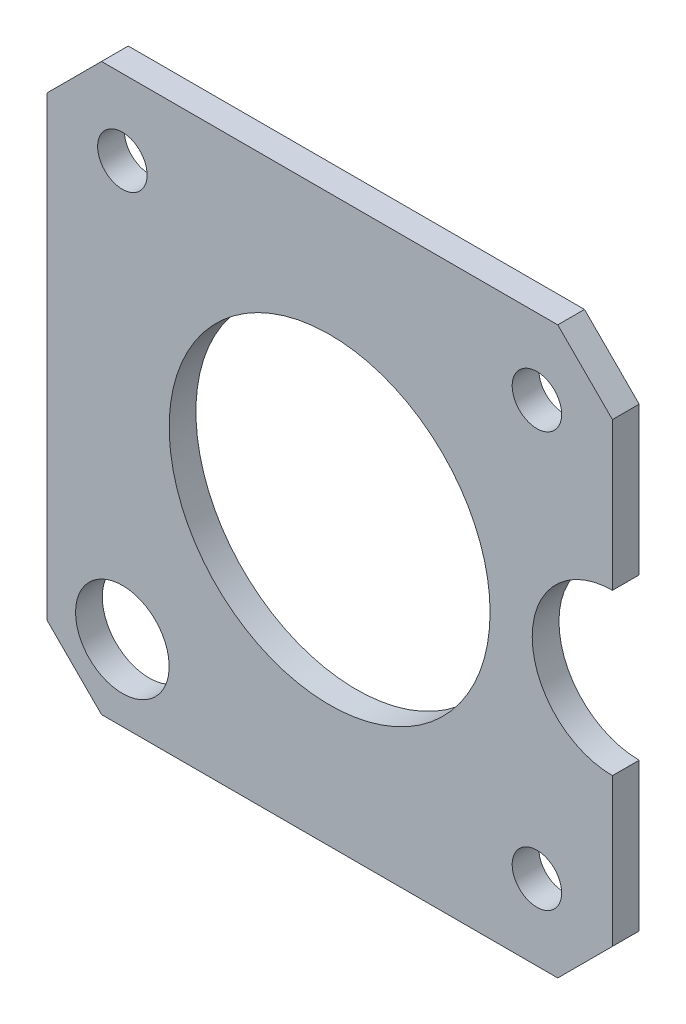
ISO-10303-21;
HEADER;
FILE_DESCRIPTION(('STEP AP214'),'2;1');
FILE_NAME('part.step','',(''),(''),'','','');
FILE_SCHEMA(('AUTOMOTIVE_DESIGN { 1 0 10303 214 1 1 1 1 }'));
ENDSEC;
DATA;
#1=APPLICATION_CONTEXT('core data for automotive mechanical design processes');
#2=APPLICATION_PROTOCOL_DEFINITION('international standard','automotive_design',2000,#1);
#3=PRODUCT_CONTEXT('',#1,'mechanical');
#4=PRODUCT('Part','Part','',(#3));
#5=PRODUCT_RELATED_PRODUCT_CATEGORY('part','',(#4));
#6=PRODUCT_DEFINITION_FORMATION('','',#4);
#7=PRODUCT_DEFINITION_CONTEXT('part definition',#1,'design');
#8=PRODUCT_DEFINITION('design','',#6,#7);
#9=PRODUCT_DEFINITION_SHAPE('','',#8);
#10=(LENGTH_UNIT() NAMED_UNIT(*) SI_UNIT(.MILLI.,.METRE.));
#11=(NAMED_UNIT(*) PLANE_ANGLE_UNIT() SI_UNIT($,.RADIAN.));
#12=(NAMED_UNIT(*) SI_UNIT($,.STERADIAN.) SOLID_ANGLE_UNIT());
#13=UNCERTAINTY_MEASURE_WITH_UNIT(LENGTH_MEASURE(1.E-05),#10,'distance_accuracy_value','');
#14=(GEOMETRIC_REPRESENTATION_CONTEXT(3) GLOBAL_UNCERTAINTY_ASSIGNED_CONTEXT((#13)) GLOBAL_UNIT_ASSIGNED_CONTEXT((#10,
#11,#12)) REPRESENTATION_CONTEXT('',''));
#15=CARTESIAN_POINT('',(0.,0.,0.));
#16=DIRECTION('',(0.,0.,1.));
#17=DIRECTION('',(1.,0.,0.));
#18=AXIS2_PLACEMENT_3D('',#15,#16,#17);
#19=CARTESIAN_POINT('',(42.3,0.,2.));
#20=DIRECTION('',(-1.,0.,0.));
#21=DIRECTION('',(0.,0.,1.));
#22=AXIS2_PLACEMENT_3D('',#19,#20,#21);
#23=PLANE('',#22);
#24=DIRECTION('',(0.,1.,0.));
#25=VECTOR('',#24,1.);
#26=CARTESIAN_POINT('',(42.3,0.,2.));
#27=LINE('',#26,#25);
#28=CARTESIAN_POINT('',(42.3,27.15,2.));
#29=VERTEX_POINT('',#28);
#30=CARTESIAN_POINT('',(42.3,38.21,2.));
#31=VERTEX_POINT('',#30);
#32=EDGE_CURVE('E68',#29,#31,#27,.T.);
#33=ORIENTED_EDGE('',*,*,#32,.F.);
#34=DIRECTION('',(0.,0.,-1.));
#35=VECTOR('',#34,1.);
#36=CARTESIAN_POINT('',(42.3,27.15,2.));
#37=LINE('',#36,#35);
#38=CARTESIAN_POINT('',(42.3,27.15,0.));
#39=VERTEX_POINT('',#38);
#40=EDGE_CURVE('E13',#29,#39,#37,.T.);
#41=ORIENTED_EDGE('',*,*,#40,.T.);
#42=DIRECTION('',(0.,1.,0.));
#43=VECTOR('',#42,1.);
#44=CARTESIAN_POINT('',(42.3,0.,0.));
#45=LINE('',#44,#43);
#46=CARTESIAN_POINT('',(42.3,38.21,0.));
#47=VERTEX_POINT('',#46);
#48=EDGE_CURVE('E130',#39,#47,#45,.T.);
#49=ORIENTED_EDGE('',*,*,#48,.T.);
#50=DIRECTION('',(0.,0.,1.));
#51=VECTOR('',#50,1.);
#52=CARTESIAN_POINT('',(42.3,38.21,2.));
#53=LINE('',#52,#51);
#54=EDGE_CURVE('E180',#47,#31,#53,.T.);
#55=ORIENTED_EDGE('',*,*,#54,.T.);
#56=EDGE_LOOP('',(#33,#41,#49,#55));
#57=FACE_BOUND('',#56,.T.);
#58=ADVANCED_FACE('F46',(#57),#23,.F.);
#59=CARTESIAN_POINT('',(0.,0.,2.));
#60=DIRECTION('',(0.,0.,-1.));
#61=DIRECTION('',(-1.,0.,0.));
#62=AXIS2_PLACEMENT_3D('',#59,#60,#61);
#63=PLANE('',#62);
#64=CARTESIAN_POINT('',(5.65,5.65,2.));
#65=DIRECTION('',(0.,0.,-1.));
#66=DIRECTION('',(-1.,0.,0.));
#67=AXIS2_PLACEMENT_3D('',#64,#65,#66);
#68=CIRCLE('',#67,3.5);
#69=CARTESIAN_POINT('',(2.15,5.65,2.));
#70=VERTEX_POINT('',#69);
#71=EDGE_CURVE('E127',#70,#70,#68,.T.);
#72=ORIENTED_EDGE('',*,*,#71,.T.);
#73=EDGE_LOOP('',(#72));
#74=FACE_BOUND('',#73,.T.);
#75=CARTESIAN_POINT('',(36.65,36.65,2.));
#76=DIRECTION('',(0.,0.,1.));
#77=DIRECTION('',(-1.,0.,0.));
#78=AXIS2_PLACEMENT_3D('',#75,#76,#77);
#79=CIRCLE('',#78,1.85);
#80=CARTESIAN_POINT('',(34.8,36.65,2.));
#81=VERTEX_POINT('',#80);
#82=EDGE_CURVE('E303',#81,#81,#79,.T.);
#83=ORIENTED_EDGE('',*,*,#82,.F.);
#84=EDGE_LOOP('',(#83));
#85=FACE_BOUND('',#84,.T.);
#86=CARTESIAN_POINT('',(42.3,4.09,2.));
#87=VERTEX_POINT('',#86);
#88=CARTESIAN_POINT('',(42.3,15.15,2.));
#89=VERTEX_POINT('',#88);
#90=EDGE_CURVE('E188',#87,#89,#27,.T.);
#91=ORIENTED_EDGE('',*,*,#90,.T.);
#92=CARTESIAN_POINT('',(42.3,21.15,2.));
#93=DIRECTION('',(0.,0.,-1.));
#94=DIRECTION('',(-1.,0.,0.));
#95=AXIS2_PLACEMENT_3D('',#92,#93,#94);
#96=CIRCLE('',#95,6.);
#97=EDGE_CURVE('E61',#89,#29,#96,.T.);
#98=ORIENTED_EDGE('',*,*,#97,.T.);
#99=ORIENTED_EDGE('',*,*,#32,.T.);
#100=DIRECTION('',(0.707106781186546,-0.707106781186549,0.));
#101=VECTOR('',#100,1.);
#102=CARTESIAN_POINT('',(38.21,42.3,2.));
#103=LINE('',#102,#101);
#104=CARTESIAN_POINT('',(38.21,42.3,2.));
#105=VERTEX_POINT('',#104);
#106=EDGE_CURVE('E167',#31,#105,#103,.F.);
#107=ORIENTED_EDGE('',*,*,#106,.T.);
#108=DIRECTION('',(-1.,0.,0.));
#109=VECTOR('',#108,1.);
#110=CARTESIAN_POINT('',(0.,42.3,2.));
#111=LINE('',#110,#109);
#112=CARTESIAN_POINT('',(4.09000000000001,42.3,2.));
#113=VERTEX_POINT('',#112);
#114=EDGE_CURVE('E152',#105,#113,#111,.T.);
#115=ORIENTED_EDGE('',*,*,#114,.T.);
#116=DIRECTION('',(0.707106781186549,0.707106781186546,0.));
#117=VECTOR('',#116,1.);
#118=CARTESIAN_POINT('',(0.,38.21,2.));
#119=LINE('',#118,#117);
#120=CARTESIAN_POINT('',(0.,38.21,2.));
#121=VERTEX_POINT('',#120);
#122=EDGE_CURVE('E173',#113,#121,#119,.F.);
#123=ORIENTED_EDGE('',*,*,#122,.T.);
#124=DIRECTION('',(0.,-1.,0.));
#125=VECTOR('',#124,1.);
#126=CARTESIAN_POINT('',(0.,0.,2.));
#127=LINE('',#126,#125);
#128=CARTESIAN_POINT('',(0.,4.09000000000001,2.));
#129=VERTEX_POINT('',#128);
#130=EDGE_CURVE('E148',#121,#129,#127,.T.);
#131=ORIENTED_EDGE('',*,*,#130,.T.);
#132=DIRECTION('',(-0.707106781186546,0.707106781186549,0.));
#133=VECTOR('',#132,1.);
#134=CARTESIAN_POINT('',(4.09,0.,2.));
#135=LINE('',#134,#133);
#136=CARTESIAN_POINT('',(4.09,0.,2.));
#137=VERTEX_POINT('',#136);
#138=EDGE_CURVE('E171',#129,#137,#135,.F.);
#139=ORIENTED_EDGE('',*,*,#138,.T.);
#140=DIRECTION('',(1.,0.,0.));
#141=VECTOR('',#140,1.);
#142=CARTESIAN_POINT('',(0.,0.,2.));
#143=LINE('',#142,#141);
#144=CARTESIAN_POINT('',(38.21,0.,2.));
#145=VERTEX_POINT('',#144);
#146=EDGE_CURVE('E197',#137,#145,#143,.T.);
#147=ORIENTED_EDGE('',*,*,#146,.T.);
#148=DIRECTION('',(-0.707106781186549,-0.707106781186546,0.));
#149=VECTOR('',#148,1.);
#150=CARTESIAN_POINT('',(42.3,4.09,2.));
#151=LINE('',#150,#149);
#152=EDGE_CURVE('E169',#145,#87,#151,.F.);
#153=ORIENTED_EDGE('',*,*,#152,.T.);
#154=EDGE_LOOP('',(#91,#98,#99,#107,#115,#123,#131,#139,#147,#153));
#155=FACE_BOUND('',#154,.T.);
#156=CARTESIAN_POINT('',(5.65,36.65,2.));
#157=DIRECTION('',(0.,0.,1.));
#158=DIRECTION('',(1.,0.,0.));
#159=AXIS2_PLACEMENT_3D('',#156,#157,#158);
#160=CIRCLE('',#159,1.85);
#161=CARTESIAN_POINT('',(7.5,36.65,2.));
#162=VERTEX_POINT('',#161);
#163=EDGE_CURVE('E201',#162,#162,#160,.T.);
#164=ORIENTED_EDGE('',*,*,#163,.F.);
#165=EDGE_LOOP('',(#164));
#166=FACE_BOUND('',#165,.T.);
#167=CARTESIAN_POINT('',(36.65,5.65,2.));
#168=DIRECTION('',(0.,0.,1.));
#169=DIRECTION('',(-1.,0.,0.));
#170=AXIS2_PLACEMENT_3D('',#167,#168,#169);
#171=CIRCLE('',#170,1.85);
#172=CARTESIAN_POINT('',(34.8,5.65,2.));
#173=VERTEX_POINT('',#172);
#174=EDGE_CURVE('E211',#173,#173,#171,.T.);
#175=ORIENTED_EDGE('',*,*,#174,.F.);
#176=EDGE_LOOP('',(#175));
#177=FACE_BOUND('',#176,.T.);
#178=CARTESIAN_POINT('',(21.15,21.15,2.));
#179=DIRECTION('',(0.,0.,1.));
#180=DIRECTION('',(1.,0.,0.));
#181=AXIS2_PLACEMENT_3D('',#178,#179,#180);
#182=CIRCLE('',#181,12.);
#183=CARTESIAN_POINT('',(33.15,21.15,2.));
#184=VERTEX_POINT('',#183);
#185=EDGE_CURVE('E297',#184,#184,#182,.T.);
#186=ORIENTED_EDGE('',*,*,#185,.F.);
#187=EDGE_LOOP('',(#186));
#188=FACE_BOUND('',#187,.T.);
#189=ADVANCED_FACE('F190',(#74,#85,#155,#166,#177,#188),#63,.F.);
#190=CARTESIAN_POINT('',(0.,0.,0.));
#191=DIRECTION('',(0.,0.,-1.));
#192=DIRECTION('',(-1.,0.,0.));
#193=AXIS2_PLACEMENT_3D('',#190,#191,#192);
#194=PLANE('',#193);
#195=CARTESIAN_POINT('',(5.65,5.65,0.));
#196=DIRECTION('',(0.,0.,-1.));
#197=DIRECTION('',(-1.,0.,0.));
#198=AXIS2_PLACEMENT_3D('',#195,#196,#197);
#199=CIRCLE('',#198,3.5);
#200=CARTESIAN_POINT('',(2.15,5.65,0.));
#201=VERTEX_POINT('',#200);
#202=EDGE_CURVE('E291',#201,#201,#199,.T.);
#203=ORIENTED_EDGE('',*,*,#202,.F.);
#204=EDGE_LOOP('',(#203));
#205=FACE_BOUND('',#204,.T.);
#206=CARTESIAN_POINT('',(42.3,21.15,0.));
#207=DIRECTION('',(0.,0.,-1.));
#208=DIRECTION('',(-1.,0.,0.));
#209=AXIS2_PLACEMENT_3D('',#206,#207,#208);
#210=CIRCLE('',#209,6.);
#211=CARTESIAN_POINT('',(42.3,15.15,0.));
#212=VERTEX_POINT('',#211);
#213=EDGE_CURVE('E121',#212,#39,#210,.T.);
#214=ORIENTED_EDGE('',*,*,#213,.F.);
#215=CARTESIAN_POINT('',(42.3,4.09,0.));
#216=VERTEX_POINT('',#215);
#217=EDGE_CURVE('E137',#216,#212,#45,.T.);
#218=ORIENTED_EDGE('',*,*,#217,.F.);
#219=DIRECTION('',(0.707106781186549,0.707106781186546,0.));
#220=VECTOR('',#219,1.);
#221=CARTESIAN_POINT('',(19.1049999999999,-19.105,0.));
#222=LINE('',#221,#220);
#223=CARTESIAN_POINT('',(38.21,0.,0.));
#224=VERTEX_POINT('',#223);
#225=EDGE_CURVE('E156',#216,#224,#222,.F.);
#226=ORIENTED_EDGE('',*,*,#225,.T.);
#227=DIRECTION('',(1.,0.,0.));
#228=VECTOR('',#227,1.);
#229=CARTESIAN_POINT('',(0.,0.,0.));
#230=LINE('',#229,#228);
#231=CARTESIAN_POINT('',(4.09,0.,0.));
#232=VERTEX_POINT('',#231);
#233=EDGE_CURVE('E138',#232,#224,#230,.T.);
#234=ORIENTED_EDGE('',*,*,#233,.F.);
#235=DIRECTION('',(0.707106781186546,-0.707106781186549,0.));
#236=VECTOR('',#235,1.);
#237=CARTESIAN_POINT('',(2.04500000000001,2.045,0.));
#238=LINE('',#237,#236);
#239=CARTESIAN_POINT('',(0.,4.09000000000001,0.));
#240=VERTEX_POINT('',#239);
#241=EDGE_CURVE('E158',#232,#240,#238,.F.);
#242=ORIENTED_EDGE('',*,*,#241,.T.);
#243=DIRECTION('',(0.,-1.,0.));
#244=VECTOR('',#243,1.);
#245=CARTESIAN_POINT('',(0.,0.,0.));
#246=LINE('',#245,#244);
#247=CARTESIAN_POINT('',(0.,38.21,0.));
#248=VERTEX_POINT('',#247);
#249=EDGE_CURVE('E142',#248,#240,#246,.T.);
#250=ORIENTED_EDGE('',*,*,#249,.F.);
#251=DIRECTION('',(-0.707106781186549,-0.707106781186546,0.));
#252=VECTOR('',#251,1.);
#253=CARTESIAN_POINT('',(-19.105,19.1050000000001,0.));
#254=LINE('',#253,#252);
#255=CARTESIAN_POINT('',(4.09000000000001,42.3,0.));
#256=VERTEX_POINT('',#255);
#257=EDGE_CURVE('E160',#248,#256,#254,.F.);
#258=ORIENTED_EDGE('',*,*,#257,.T.);
#259=DIRECTION('',(-1.,0.,0.));
#260=VECTOR('',#259,1.);
#261=CARTESIAN_POINT('',(0.,42.3,0.));
#262=LINE('',#261,#260);
#263=CARTESIAN_POINT('',(38.21,42.3,0.));
#264=VERTEX_POINT('',#263);
#265=EDGE_CURVE('E140',#264,#256,#262,.T.);
#266=ORIENTED_EDGE('',*,*,#265,.F.);
#267=DIRECTION('',(-0.707106781186546,0.707106781186549,0.));
#268=VECTOR('',#267,1.);
#269=CARTESIAN_POINT('',(40.2550000000001,40.2549999999999,0.));
#270=LINE('',#269,#268);
#271=EDGE_CURVE('E135',#264,#47,#270,.F.);
#272=ORIENTED_EDGE('',*,*,#271,.T.);
#273=ORIENTED_EDGE('',*,*,#48,.F.);
#274=EDGE_LOOP('',(#214,#218,#226,#234,#242,#250,#258,#266,#272,#273));
#275=FACE_BOUND('',#274,.T.);
#276=CARTESIAN_POINT('',(36.65,36.65,0.));
#277=DIRECTION('',(0.,0.,1.));
#278=DIRECTION('',(-1.,0.,0.));
#279=AXIS2_PLACEMENT_3D('',#276,#277,#278);
#280=CIRCLE('',#279,1.85);
#281=CARTESIAN_POINT('',(34.8,36.65,0.));
#282=VERTEX_POINT('',#281);
#283=EDGE_CURVE('E300',#282,#282,#280,.T.);
#284=ORIENTED_EDGE('',*,*,#283,.T.);
#285=EDGE_LOOP('',(#284));
#286=FACE_BOUND('',#285,.T.);
#287=CARTESIAN_POINT('',(5.65,36.65,0.));
#288=DIRECTION('',(0.,0.,1.));
#289=DIRECTION('',(1.,0.,0.));
#290=AXIS2_PLACEMENT_3D('',#287,#288,#289);
#291=CIRCLE('',#290,1.85);
#292=CARTESIAN_POINT('',(7.5,36.65,0.));
#293=VERTEX_POINT('',#292);
#294=EDGE_CURVE('E206',#293,#293,#291,.T.);
#295=ORIENTED_EDGE('',*,*,#294,.T.);
#296=EDGE_LOOP('',(#295));
#297=FACE_BOUND('',#296,.T.);
#298=CARTESIAN_POINT('',(36.65,5.65,0.));
#299=DIRECTION('',(0.,0.,1.));
#300=DIRECTION('',(-1.,0.,0.));
#301=AXIS2_PLACEMENT_3D('',#298,#299,#300);
#302=CIRCLE('',#301,1.85);
#303=CARTESIAN_POINT('',(34.8,5.65,0.));
#304=VERTEX_POINT('',#303);
#305=EDGE_CURVE('E214',#304,#304,#302,.T.);
#306=ORIENTED_EDGE('',*,*,#305,.T.);
#307=EDGE_LOOP('',(#306));
#308=FACE_BOUND('',#307,.T.);
#309=CARTESIAN_POINT('',(21.15,21.15,0.));
#310=DIRECTION('',(0.,0.,1.));
#311=DIRECTION('',(1.,0.,0.));
#312=AXIS2_PLACEMENT_3D('',#309,#310,#311);
#313=CIRCLE('',#312,12.);
#314=CARTESIAN_POINT('',(33.15,21.15,0.));
#315=VERTEX_POINT('',#314);
#316=EDGE_CURVE('E295',#315,#315,#313,.T.);
#317=ORIENTED_EDGE('',*,*,#316,.T.);
#318=EDGE_LOOP('',(#317));
#319=FACE_BOUND('',#318,.T.);
#320=ADVANCED_FACE('F132',(#205,#275,#286,#297,#308,#319),#194,.T.);
#321=CARTESIAN_POINT('',(0.,0.,2.));
#322=DIRECTION('',(1.,0.,0.));
#323=DIRECTION('',(0.,0.,-1.));
#324=AXIS2_PLACEMENT_3D('',#321,#322,#323);
#325=PLANE('',#324);
#326=ORIENTED_EDGE('',*,*,#130,.F.);
#327=DIRECTION('',(0.,0.,-1.));
#328=VECTOR('',#327,1.);
#329=CARTESIAN_POINT('',(0.,38.21,2.));
#330=LINE('',#329,#328);
#331=EDGE_CURVE('E151',#121,#248,#330,.T.);
#332=ORIENTED_EDGE('',*,*,#331,.T.);
#333=ORIENTED_EDGE('',*,*,#249,.T.);
#334=DIRECTION('',(0.,0.,1.));
#335=VECTOR('',#334,1.);
#336=CARTESIAN_POINT('',(0.,4.09000000000001,2.));
#337=LINE('',#336,#335);
#338=EDGE_CURVE('E149',#240,#129,#337,.T.);
#339=ORIENTED_EDGE('',*,*,#338,.T.);
#340=EDGE_LOOP('',(#326,#332,#333,#339));
#341=FACE_BOUND('',#340,.T.);
#342=ADVANCED_FACE('F238',(#341),#325,.F.);
#343=CARTESIAN_POINT('',(0.,0.,2.));
#344=DIRECTION('',(0.,1.,0.));
#345=DIRECTION('',(0.,0.,1.));
#346=AXIS2_PLACEMENT_3D('',#343,#344,#345);
#347=PLANE('',#346);
#348=ORIENTED_EDGE('',*,*,#146,.F.);
#349=DIRECTION('',(0.,0.,-1.));
#350=VECTOR('',#349,1.);
#351=CARTESIAN_POINT('',(4.09,0.,2.));
#352=LINE('',#351,#350);
#353=EDGE_CURVE('E177',#137,#232,#352,.T.);
#354=ORIENTED_EDGE('',*,*,#353,.T.);
#355=ORIENTED_EDGE('',*,*,#233,.T.);
#356=DIRECTION('',(0.,0.,1.));
#357=VECTOR('',#356,1.);
#358=CARTESIAN_POINT('',(38.21,0.,2.));
#359=LINE('',#358,#357);
#360=EDGE_CURVE('E175',#224,#145,#359,.T.);
#361=ORIENTED_EDGE('',*,*,#360,.T.);
#362=EDGE_LOOP('',(#348,#354,#355,#361));
#363=FACE_BOUND('',#362,.T.);
#364=ADVANCED_FACE('F226',(#363),#347,.F.);
#365=ORIENTED_EDGE('',*,*,#217,.T.);
#366=DIRECTION('',(0.,0.,-1.));
#367=VECTOR('',#366,1.);
#368=CARTESIAN_POINT('',(42.3,15.15,2.));
#369=LINE('',#368,#367);
#370=EDGE_CURVE('E54',#212,#89,#369,.F.);
#371=ORIENTED_EDGE('',*,*,#370,.T.);
#372=ORIENTED_EDGE('',*,*,#90,.F.);
#373=DIRECTION('',(0.,0.,-1.));
#374=VECTOR('',#373,1.);
#375=CARTESIAN_POINT('',(42.3,4.09,2.));
#376=LINE('',#375,#374);
#377=EDGE_CURVE('E182',#87,#216,#376,.T.);
#378=ORIENTED_EDGE('',*,*,#377,.T.);
#379=EDGE_LOOP('',(#365,#371,#372,#378));
#380=FACE_BOUND('',#379,.T.);
#381=ADVANCED_FACE('F187',(#380),#23,.F.);
#382=CARTESIAN_POINT('',(0.,42.3,2.));
#383=DIRECTION('',(0.,-1.,0.));
#384=DIRECTION('',(0.,0.,-1.));
#385=AXIS2_PLACEMENT_3D('',#382,#383,#384);
#386=PLANE('',#385);
#387=ORIENTED_EDGE('',*,*,#265,.T.);
#388=DIRECTION('',(0.,0.,1.));
#389=VECTOR('',#388,1.);
#390=CARTESIAN_POINT('',(4.09000000000001,42.3,2.));
#391=LINE('',#390,#389);
#392=EDGE_CURVE('E165',#256,#113,#391,.T.);
#393=ORIENTED_EDGE('',*,*,#392,.T.);
#394=ORIENTED_EDGE('',*,*,#114,.F.);
#395=DIRECTION('',(0.,0.,-1.));
#396=VECTOR('',#395,1.);
#397=CARTESIAN_POINT('',(38.21,42.3,2.));
#398=LINE('',#397,#396);
#399=EDGE_CURVE('E162',#105,#264,#398,.T.);
#400=ORIENTED_EDGE('',*,*,#399,.T.);
#401=EDGE_LOOP('',(#387,#393,#394,#400));
#402=FACE_BOUND('',#401,.T.);
#403=ADVANCED_FACE('F233',(#402),#386,.F.);
#404=CARTESIAN_POINT('',(5.65,36.65,2.));
#405=DIRECTION('',(0.,0.,-1.));
#406=DIRECTION('',(-1.,0.,0.));
#407=AXIS2_PLACEMENT_3D('',#404,#405,#406);
#408=CYLINDRICAL_SURFACE('',#407,1.85);
#409=ORIENTED_EDGE('',*,*,#163,.T.);
#410=EDGE_LOOP('',(#409));
#411=FACE_BOUND('',#410,.T.);
#412=ORIENTED_EDGE('',*,*,#294,.F.);
#413=EDGE_LOOP('',(#412));
#414=FACE_BOUND('',#413,.T.);
#415=ADVANCED_FACE('F261',(#411,#414),#408,.F.);
#416=CARTESIAN_POINT('',(36.65,5.65,2.));
#417=DIRECTION('',(0.,0.,-1.));
#418=DIRECTION('',(-1.,0.,0.));
#419=AXIS2_PLACEMENT_3D('',#416,#417,#418);
#420=CYLINDRICAL_SURFACE('',#419,1.85);
#421=ORIENTED_EDGE('',*,*,#174,.T.);
#422=EDGE_LOOP('',(#421));
#423=FACE_BOUND('',#422,.T.);
#424=ORIENTED_EDGE('',*,*,#305,.F.);
#425=EDGE_LOOP('',(#424));
#426=FACE_BOUND('',#425,.T.);
#427=ADVANCED_FACE('F265',(#423,#426),#420,.F.);
#428=CARTESIAN_POINT('',(36.65,36.65,2.));
#429=DIRECTION('',(0.,0.,-1.));
#430=DIRECTION('',(-1.,0.,0.));
#431=AXIS2_PLACEMENT_3D('',#428,#429,#430);
#432=CYLINDRICAL_SURFACE('',#431,1.85);
#433=ORIENTED_EDGE('',*,*,#82,.T.);
#434=EDGE_LOOP('',(#433));
#435=FACE_BOUND('',#434,.T.);
#436=ORIENTED_EDGE('',*,*,#283,.F.);
#437=EDGE_LOOP('',(#436));
#438=FACE_BOUND('',#437,.T.);
#439=ADVANCED_FACE('F270',(#435,#438),#432,.F.);
#440=CARTESIAN_POINT('',(21.15,21.15,2.));
#441=DIRECTION('',(0.,0.,-1.));
#442=DIRECTION('',(-1.,0.,0.));
#443=AXIS2_PLACEMENT_3D('',#440,#441,#442);
#444=CYLINDRICAL_SURFACE('',#443,12.);
#445=ORIENTED_EDGE('',*,*,#185,.T.);
#446=EDGE_LOOP('',(#445));
#447=FACE_BOUND('',#446,.T.);
#448=ORIENTED_EDGE('',*,*,#316,.F.);
#449=EDGE_LOOP('',(#448));
#450=FACE_BOUND('',#449,.T.);
#451=ADVANCED_FACE('F274',(#447,#450),#444,.F.);
#452=CARTESIAN_POINT('',(0.,38.21,2.));
#453=DIRECTION('',(0.707106781186546,-0.707106781186549,0.));
#454=DIRECTION('',(0.,0.,-1.));
#455=AXIS2_PLACEMENT_3D('',#452,#453,#454);
#456=PLANE('',#455);
#457=ORIENTED_EDGE('',*,*,#122,.F.);
#458=ORIENTED_EDGE('',*,*,#392,.F.);
#459=ORIENTED_EDGE('',*,*,#257,.F.);
#460=ORIENTED_EDGE('',*,*,#331,.F.);
#461=EDGE_LOOP('',(#457,#458,#459,#460));
#462=FACE_BOUND('',#461,.T.);
#463=ADVANCED_FACE('F237',(#462),#456,.F.);
#464=CARTESIAN_POINT('',(4.09,0.,2.));
#465=DIRECTION('',(0.707106781186549,0.707106781186546,0.));
#466=DIRECTION('',(0.,0.,-1.));
#467=AXIS2_PLACEMENT_3D('',#464,#465,#466);
#468=PLANE('',#467);
#469=ORIENTED_EDGE('',*,*,#138,.F.);
#470=ORIENTED_EDGE('',*,*,#338,.F.);
#471=ORIENTED_EDGE('',*,*,#241,.F.);
#472=ORIENTED_EDGE('',*,*,#353,.F.);
#473=EDGE_LOOP('',(#469,#470,#471,#472));
#474=FACE_BOUND('',#473,.T.);
#475=ADVANCED_FACE('F228',(#474),#468,.F.);
#476=CARTESIAN_POINT('',(42.3,4.09,2.));
#477=DIRECTION('',(-0.707106781186546,0.707106781186549,0.));
#478=DIRECTION('',(0.,0.,-1.));
#479=AXIS2_PLACEMENT_3D('',#476,#477,#478);
#480=PLANE('',#479);
#481=ORIENTED_EDGE('',*,*,#152,.F.);
#482=ORIENTED_EDGE('',*,*,#360,.F.);
#483=ORIENTED_EDGE('',*,*,#225,.F.);
#484=ORIENTED_EDGE('',*,*,#377,.F.);
#485=EDGE_LOOP('',(#481,#482,#483,#484));
#486=FACE_BOUND('',#485,.T.);
#487=ADVANCED_FACE('F224',(#486),#480,.F.);
#488=CARTESIAN_POINT('',(38.21,42.3,2.));
#489=DIRECTION('',(-0.707106781186549,-0.707106781186546,0.));
#490=DIRECTION('',(0.,0.,-1.));
#491=AXIS2_PLACEMENT_3D('',#488,#489,#490);
#492=PLANE('',#491);
#493=ORIENTED_EDGE('',*,*,#106,.F.);
#494=ORIENTED_EDGE('',*,*,#54,.F.);
#495=ORIENTED_EDGE('',*,*,#271,.F.);
#496=ORIENTED_EDGE('',*,*,#399,.F.);
#497=EDGE_LOOP('',(#493,#494,#495,#496));
#498=FACE_BOUND('',#497,.T.);
#499=ADVANCED_FACE('F48',(#498),#492,.F.);
#500=CARTESIAN_POINT('',(42.3,21.15,2.));
#501=DIRECTION('',(0.,0.,-1.));
#502=DIRECTION('',(-1.,0.,0.));
#503=AXIS2_PLACEMENT_3D('',#500,#501,#502);
#504=CYLINDRICAL_SURFACE('',#503,6.);
#505=ORIENTED_EDGE('',*,*,#97,.F.);
#506=ORIENTED_EDGE('',*,*,#370,.F.);
#507=ORIENTED_EDGE('',*,*,#213,.T.);
#508=ORIENTED_EDGE('',*,*,#40,.F.);
#509=EDGE_LOOP('',(#505,#506,#507,#508));
#510=FACE_BOUND('',#509,.T.);
#511=ADVANCED_FACE('F122',(#510),#504,.F.);
#512=CARTESIAN_POINT('',(5.65,5.65,2.));
#513=DIRECTION('',(0.,0.,-1.));
#514=DIRECTION('',(-1.,0.,0.));
#515=AXIS2_PLACEMENT_3D('',#512,#513,#514);
#516=CYLINDRICAL_SURFACE('',#515,3.5);
#517=ORIENTED_EDGE('',*,*,#71,.F.);
#518=EDGE_LOOP('',(#517));
#519=FACE_BOUND('',#518,.T.);
#520=ORIENTED_EDGE('',*,*,#202,.T.);
#521=EDGE_LOOP('',(#520));
#522=FACE_BOUND('',#521,.T.);
#523=ADVANCED_FACE('F281',(#519,#522),#516,.F.);
#524=CLOSED_SHELL('',(#58,#189,#320,#342,#364,#381,#403,#415,#427,#439,#451,#463,#475,#487,#499,
#511,#523));
#525=MANIFOLD_SOLID_BREP('B2',#524);
#526=ADVANCED_BREP_SHAPE_REPRESENTATION('',(#18,#525),#14);
#527=SHAPE_DEFINITION_REPRESENTATION(#9,#526);
ENDSEC;
END-ISO-10303-21;
